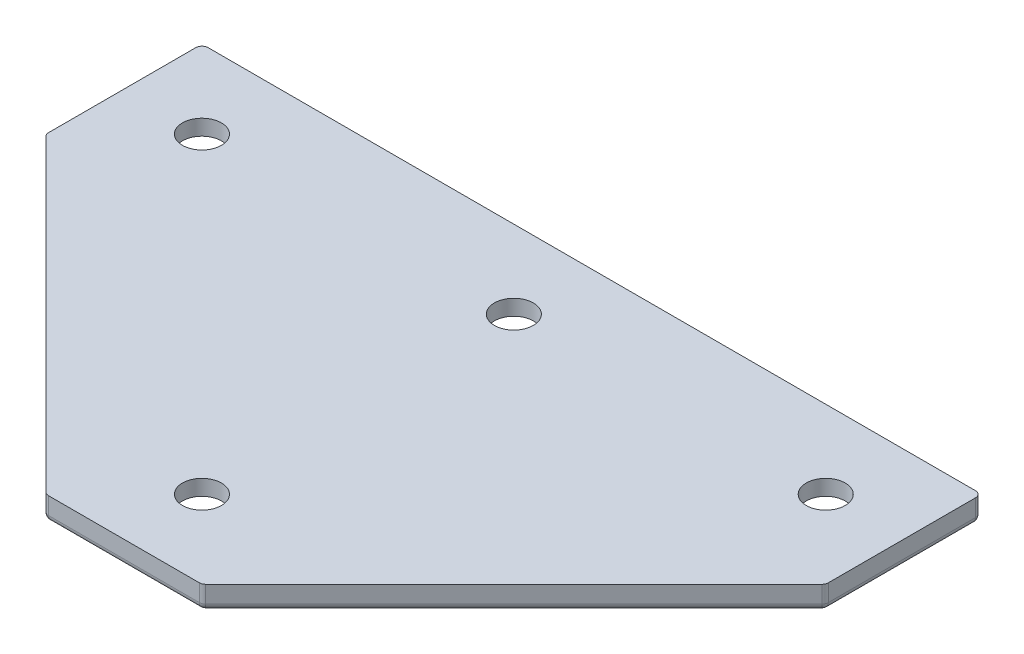
ISO-10303-21;
HEADER;
FILE_DESCRIPTION(('STEP AP214'),'2;1');
FILE_NAME('part.step','',(''),(''),'','','');
FILE_SCHEMA(('AUTOMOTIVE_DESIGN { 1 0 10303 214 1 1 1 1 }'));
ENDSEC;
DATA;
#1=APPLICATION_CONTEXT('core data for automotive mechanical design processes');
#2=APPLICATION_PROTOCOL_DEFINITION('international standard','automotive_design',2000,#1);
#3=PRODUCT_CONTEXT('',#1,'mechanical');
#4=PRODUCT('Part','Part','',(#3));
#5=PRODUCT_RELATED_PRODUCT_CATEGORY('part','',(#4));
#6=PRODUCT_DEFINITION_FORMATION('','',#4);
#7=PRODUCT_DEFINITION_CONTEXT('part definition',#1,'design');
#8=PRODUCT_DEFINITION('design','',#6,#7);
#9=PRODUCT_DEFINITION_SHAPE('','',#8);
#10=(LENGTH_UNIT() NAMED_UNIT(*) SI_UNIT(.MILLI.,.METRE.));
#11=(NAMED_UNIT(*) PLANE_ANGLE_UNIT() SI_UNIT($,.RADIAN.));
#12=(NAMED_UNIT(*) SI_UNIT($,.STERADIAN.) SOLID_ANGLE_UNIT());
#13=UNCERTAINTY_MEASURE_WITH_UNIT(LENGTH_MEASURE(1.E-05),#10,'distance_accuracy_value','');
#14=(GEOMETRIC_REPRESENTATION_CONTEXT(3) GLOBAL_UNCERTAINTY_ASSIGNED_CONTEXT((#13)) GLOBAL_UNIT_ASSIGNED_CONTEXT((#10,
#11,#12)) REPRESENTATION_CONTEXT('',''));
#15=CARTESIAN_POINT('',(0.,0.,0.));
#16=DIRECTION('',(0.,0.,1.));
#17=DIRECTION('',(1.,0.,0.));
#18=AXIS2_PLACEMENT_3D('',#15,#16,#17);
#19=CARTESIAN_POINT('',(-50.,0.,10.));
#20=DIRECTION('',(0.,-1.,0.));
#21=DIRECTION('',(1.,0.,0.));
#22=AXIS2_PLACEMENT_3D('',#19,#20,#21);
#23=CYLINDRICAL_SURFACE('',#22,2.5);
#24=CARTESIAN_POINT('',(-50.,-2.,10.));
#25=DIRECTION('',(0.,-1.,0.));
#26=DIRECTION('',(1.,0.,0.));
#27=AXIS2_PLACEMENT_3D('',#24,#25,#26);
#28=CIRCLE('',#27,2.5);
#29=CARTESIAN_POINT('',(-47.5,-2.,10.));
#30=VERTEX_POINT('',#29);
#31=EDGE_CURVE('E11',#30,#30,#28,.T.);
#32=ORIENTED_EDGE('',*,*,#31,.F.);
#33=EDGE_LOOP('',(#32));
#34=FACE_BOUND('',#33,.T.);
#35=CARTESIAN_POINT('',(-50.,-4.,10.));
#36=DIRECTION('',(0.,-1.,0.));
#37=DIRECTION('',(1.,0.,0.));
#38=AXIS2_PLACEMENT_3D('',#35,#36,#37);
#39=CIRCLE('',#38,2.5);
#40=CARTESIAN_POINT('',(-47.5,-4.,10.));
#41=VERTEX_POINT('',#40);
#42=EDGE_CURVE('E24',#41,#41,#39,.T.);
#43=ORIENTED_EDGE('',*,*,#42,.T.);
#44=EDGE_LOOP('',(#43));
#45=FACE_BOUND('',#44,.T.);
#46=ADVANCED_FACE('F17',(#34,#45),#23,.F.);
#47=CARTESIAN_POINT('',(-90.,0.,10.));
#48=DIRECTION('',(0.,-1.,0.));
#49=DIRECTION('',(1.,0.,0.));
#50=AXIS2_PLACEMENT_3D('',#47,#48,#49);
#51=CYLINDRICAL_SURFACE('',#50,2.5);
#52=CARTESIAN_POINT('',(-90.,-2.,10.));
#53=DIRECTION('',(0.,-1.,0.));
#54=DIRECTION('',(1.,0.,0.));
#55=AXIS2_PLACEMENT_3D('',#52,#53,#54);
#56=CIRCLE('',#55,2.5);
#57=CARTESIAN_POINT('',(-87.5,-2.,10.));
#58=VERTEX_POINT('',#57);
#59=EDGE_CURVE('E316',#58,#58,#56,.T.);
#60=ORIENTED_EDGE('',*,*,#59,.F.);
#61=EDGE_LOOP('',(#60));
#62=FACE_BOUND('',#61,.T.);
#63=CARTESIAN_POINT('',(-90.,-4.,10.));
#64=DIRECTION('',(0.,-1.,0.));
#65=DIRECTION('',(1.,0.,0.));
#66=AXIS2_PLACEMENT_3D('',#63,#64,#65);
#67=CIRCLE('',#66,2.5);
#68=CARTESIAN_POINT('',(-87.5,-4.,10.));
#69=VERTEX_POINT('',#68);
#70=EDGE_CURVE('E313',#69,#69,#67,.T.);
#71=ORIENTED_EDGE('',*,*,#70,.T.);
#72=EDGE_LOOP('',(#71));
#73=FACE_BOUND('',#72,.T.);
#74=ADVANCED_FACE('F342',(#62,#73),#51,.F.);
#75=CARTESIAN_POINT('',(-10.,0.,10.));
#76=DIRECTION('',(0.,-1.,0.));
#77=DIRECTION('',(1.,0.,0.));
#78=AXIS2_PLACEMENT_3D('',#75,#76,#77);
#79=CYLINDRICAL_SURFACE('',#78,2.5);
#80=CARTESIAN_POINT('',(-10.,-2.,10.));
#81=DIRECTION('',(0.,-1.,0.));
#82=DIRECTION('',(1.,0.,0.));
#83=AXIS2_PLACEMENT_3D('',#80,#81,#82);
#84=CIRCLE('',#83,2.5);
#85=CARTESIAN_POINT('',(-7.5,-2.,10.));
#86=VERTEX_POINT('',#85);
#87=EDGE_CURVE('E310',#86,#86,#84,.T.);
#88=ORIENTED_EDGE('',*,*,#87,.F.);
#89=EDGE_LOOP('',(#88));
#90=FACE_BOUND('',#89,.T.);
#91=CARTESIAN_POINT('',(-10.,-4.,10.));
#92=DIRECTION('',(0.,-1.,0.));
#93=DIRECTION('',(1.,0.,0.));
#94=AXIS2_PLACEMENT_3D('',#91,#92,#93);
#95=CIRCLE('',#94,2.5);
#96=CARTESIAN_POINT('',(-7.5,-4.,10.));
#97=VERTEX_POINT('',#96);
#98=EDGE_CURVE('E307',#97,#97,#95,.T.);
#99=ORIENTED_EDGE('',*,*,#98,.T.);
#100=EDGE_LOOP('',(#99));
#101=FACE_BOUND('',#100,.T.);
#102=ADVANCED_FACE('F348',(#90,#101),#79,.F.);
#103=CARTESIAN_POINT('',(-50.,0.,50.));
#104=DIRECTION('',(0.,-1.,0.));
#105=DIRECTION('',(1.,0.,0.));
#106=AXIS2_PLACEMENT_3D('',#103,#104,#105);
#107=CYLINDRICAL_SURFACE('',#106,2.5);
#108=CARTESIAN_POINT('',(-50.,-2.,50.));
#109=DIRECTION('',(0.,-1.,0.));
#110=DIRECTION('',(1.,0.,0.));
#111=AXIS2_PLACEMENT_3D('',#108,#109,#110);
#112=CIRCLE('',#111,2.5);
#113=CARTESIAN_POINT('',(-47.5,-2.,50.));
#114=VERTEX_POINT('',#113);
#115=EDGE_CURVE('E304',#114,#114,#112,.T.);
#116=ORIENTED_EDGE('',*,*,#115,.F.);
#117=EDGE_LOOP('',(#116));
#118=FACE_BOUND('',#117,.T.);
#119=CARTESIAN_POINT('',(-50.,-4.,50.));
#120=DIRECTION('',(0.,-1.,0.));
#121=DIRECTION('',(1.,0.,0.));
#122=AXIS2_PLACEMENT_3D('',#119,#120,#121);
#123=CIRCLE('',#122,2.5);
#124=CARTESIAN_POINT('',(-47.5,-4.,50.));
#125=VERTEX_POINT('',#124);
#126=EDGE_CURVE('E301',#125,#125,#123,.T.);
#127=ORIENTED_EDGE('',*,*,#126,.T.);
#128=EDGE_LOOP('',(#127));
#129=FACE_BOUND('',#128,.T.);
#130=ADVANCED_FACE('F488',(#118,#129),#107,.F.);
#131=CARTESIAN_POINT('',(-60.,-5.,59.9999999999663));
#132=DIRECTION('',(0.,0.,-1.));
#133=DIRECTION('',(0.,1.,0.));
#134=AXIS2_PLACEMENT_3D('',#131,#132,#133);
#135=PLANE('',#134);
#136=DIRECTION('',(-1.,0.,0.));
#137=VECTOR('',#136,1.);
#138=CARTESIAN_POINT('',(-60.,-2.,59.9999999999663));
#139=LINE('',#138,#137);
#140=CARTESIAN_POINT('',(-40.3313708498983,-2.,59.9999999999663));
#141=VERTEX_POINT('',#140);
#142=CARTESIAN_POINT('',(-59.6686291501018,-2.,59.9999999999663));
#143=VERTEX_POINT('',#142);
#144=EDGE_CURVE('E31',#141,#143,#139,.T.);
#145=ORIENTED_EDGE('',*,*,#144,.T.);
#146=DIRECTION('',(0.,1.,0.));
#147=VECTOR('',#146,1.);
#148=CARTESIAN_POINT('',(-59.6686291501018,-5.,59.9999999999663));
#149=LINE('',#148,#147);
#150=CARTESIAN_POINT('',(-59.6686291501018,-4.2,59.9999999999663));
#151=VERTEX_POINT('',#150);
#152=EDGE_CURVE('E36',#143,#151,#149,.F.);
#153=ORIENTED_EDGE('',*,*,#152,.T.);
#154=DIRECTION('',(-1.,0.,0.));
#155=VECTOR('',#154,1.);
#156=CARTESIAN_POINT('',(-40.,-4.2,59.9999999999663));
#157=LINE('',#156,#155);
#158=CARTESIAN_POINT('',(-40.3313708498983,-4.2,59.9999999999663));
#159=VERTEX_POINT('',#158);
#160=EDGE_CURVE('E297',#151,#159,#157,.F.);
#161=ORIENTED_EDGE('',*,*,#160,.T.);
#162=DIRECTION('',(0.,1.,0.));
#163=VECTOR('',#162,1.);
#164=CARTESIAN_POINT('',(-40.3313708498983,-5.,59.9999999999663));
#165=LINE('',#164,#163);
#166=EDGE_CURVE('E295',#159,#141,#165,.T.);
#167=ORIENTED_EDGE('',*,*,#166,.T.);
#168=EDGE_LOOP('',(#145,#153,#161,#167));
#169=FACE_BOUND('',#168,.T.);
#170=ADVANCED_FACE('F485',(#169),#135,.F.);
#171=CARTESIAN_POINT('',(-100.,-5.,20.));
#172=DIRECTION('',(0.70710678118625,0.,-0.707106781186845));
#173=DIRECTION('',(0.707106781186845,0.,0.70710678118625));
#174=AXIS2_PLACEMENT_3D('',#171,#172,#173);
#175=PLANE('',#174);
#176=DIRECTION('',(-0.707106781186845,0.,-0.70710678118625));
#177=VECTOR('',#176,1.);
#178=CARTESIAN_POINT('',(-60.,-4.2,59.9999999999663));
#179=LINE('',#178,#177);
#180=CARTESIAN_POINT('',(-99.765685424949,-4.2,20.2343145750508));
#181=VERTEX_POINT('',#180);
#182=CARTESIAN_POINT('',(-60.2343145750508,-4.2,59.7656854249158));
#183=VERTEX_POINT('',#182);
#184=EDGE_CURVE('E152',#181,#183,#179,.F.);
#185=ORIENTED_EDGE('',*,*,#184,.T.);
#186=DIRECTION('',(0.,1.,0.));
#187=VECTOR('',#186,1.);
#188=CARTESIAN_POINT('',(-60.2343145750508,-5.,59.7656854249158));
#189=LINE('',#188,#187);
#190=CARTESIAN_POINT('',(-60.2343145750508,-2.,59.7656854249158));
#191=VERTEX_POINT('',#190);
#192=EDGE_CURVE('E292',#183,#191,#189,.T.);
#193=ORIENTED_EDGE('',*,*,#192,.T.);
#194=DIRECTION('',(-0.707106781186845,0.,-0.70710678118625));
#195=VECTOR('',#194,1.);
#196=CARTESIAN_POINT('',(-100.,-2.,20.));
#197=LINE('',#196,#195);
#198=CARTESIAN_POINT('',(-99.765685424949,-2.,20.2343145750508));
#199=VERTEX_POINT('',#198);
#200=EDGE_CURVE('E290',#191,#199,#197,.T.);
#201=ORIENTED_EDGE('',*,*,#200,.T.);
#202=DIRECTION('',(0.,1.,0.));
#203=VECTOR('',#202,1.);
#204=CARTESIAN_POINT('',(-99.765685424949,-5.,20.2343145750508));
#205=LINE('',#204,#203);
#206=EDGE_CURVE('E288',#199,#181,#205,.F.);
#207=ORIENTED_EDGE('',*,*,#206,.T.);
#208=EDGE_LOOP('',(#185,#193,#201,#207));
#209=FACE_BOUND('',#208,.T.);
#210=ADVANCED_FACE('F379',(#209),#175,.F.);
#211=CARTESIAN_POINT('',(-100.,-5.,0.));
#212=DIRECTION('',(1.,0.,0.));
#213=DIRECTION('',(0.,1.,0.));
#214=AXIS2_PLACEMENT_3D('',#211,#212,#213);
#215=PLANE('',#214);
#216=DIRECTION('',(0.,0.,-1.));
#217=VECTOR('',#216,1.);
#218=CARTESIAN_POINT('',(-100.,-2.,0.));
#219=LINE('',#218,#217);
#220=CARTESIAN_POINT('',(-100.,-2.,19.6686291501013));
#221=VERTEX_POINT('',#220);
#222=CARTESIAN_POINT('',(-100.,-2.,0.8));
#223=VERTEX_POINT('',#222);
#224=EDGE_CURVE('E286',#221,#223,#219,.T.);
#225=ORIENTED_EDGE('',*,*,#224,.T.);
#226=DIRECTION('',(0.,1.,0.));
#227=VECTOR('',#226,1.);
#228=CARTESIAN_POINT('',(-100.,-5.,0.8));
#229=LINE('',#228,#227);
#230=CARTESIAN_POINT('',(-100.,-4.2,0.8));
#231=VERTEX_POINT('',#230);
#232=EDGE_CURVE('E284',#223,#231,#229,.F.);
#233=ORIENTED_EDGE('',*,*,#232,.T.);
#234=DIRECTION('',(0.,0.,-1.));
#235=VECTOR('',#234,1.);
#236=CARTESIAN_POINT('',(-100.,-4.2,20.));
#237=LINE('',#236,#235);
#238=CARTESIAN_POINT('',(-100.,-4.2,19.6686291501013));
#239=VERTEX_POINT('',#238);
#240=EDGE_CURVE('E282',#231,#239,#237,.F.);
#241=ORIENTED_EDGE('',*,*,#240,.T.);
#242=DIRECTION('',(0.,1.,0.));
#243=VECTOR('',#242,1.);
#244=CARTESIAN_POINT('',(-100.,-5.,19.6686291501013));
#245=LINE('',#244,#243);
#246=EDGE_CURVE('E280',#239,#221,#245,.T.);
#247=ORIENTED_EDGE('',*,*,#246,.T.);
#248=EDGE_LOOP('',(#225,#233,#241,#247));
#249=FACE_BOUND('',#248,.T.);
#250=ADVANCED_FACE('F372',(#249),#215,.F.);
#251=CARTESIAN_POINT('',(-100.,-5.,0.));
#252=DIRECTION('',(0.,0.,1.));
#253=DIRECTION('',(0.,-1.,0.));
#254=AXIS2_PLACEMENT_3D('',#251,#252,#253);
#255=PLANE('',#254);
#256=DIRECTION('',(1.,0.,0.));
#257=VECTOR('',#256,1.);
#258=CARTESIAN_POINT('',(-100.,-4.2,0.));
#259=LINE('',#258,#257);
#260=CARTESIAN_POINT('',(-0.8,-4.2,0.));
#261=VERTEX_POINT('',#260);
#262=CARTESIAN_POINT('',(-99.2,-4.2,0.));
#263=VERTEX_POINT('',#262);
#264=EDGE_CURVE('E278',#261,#263,#259,.F.);
#265=ORIENTED_EDGE('',*,*,#264,.T.);
#266=DIRECTION('',(0.,1.,0.));
#267=VECTOR('',#266,1.);
#268=CARTESIAN_POINT('',(-99.2,-5.,0.));
#269=LINE('',#268,#267);
#270=CARTESIAN_POINT('',(-99.2,-2.,0.));
#271=VERTEX_POINT('',#270);
#272=EDGE_CURVE('E276',#263,#271,#269,.T.);
#273=ORIENTED_EDGE('',*,*,#272,.T.);
#274=DIRECTION('',(1.,0.,0.));
#275=VECTOR('',#274,1.);
#276=CARTESIAN_POINT('',(-100.,-2.,0.));
#277=LINE('',#276,#275);
#278=CARTESIAN_POINT('',(-0.8,-2.,0.));
#279=VERTEX_POINT('',#278);
#280=EDGE_CURVE('E274',#271,#279,#277,.T.);
#281=ORIENTED_EDGE('',*,*,#280,.T.);
#282=DIRECTION('',(0.,1.,0.));
#283=VECTOR('',#282,1.);
#284=CARTESIAN_POINT('',(-0.8,-5.,0.));
#285=LINE('',#284,#283);
#286=EDGE_CURVE('E272',#279,#261,#285,.F.);
#287=ORIENTED_EDGE('',*,*,#286,.T.);
#288=EDGE_LOOP('',(#265,#273,#281,#287));
#289=FACE_BOUND('',#288,.T.);
#290=ADVANCED_FACE('F469',(#289),#255,.F.);
#291=CARTESIAN_POINT('',(0.,-5.,0.));
#292=DIRECTION('',(-1.,0.,0.));
#293=DIRECTION('',(0.,-1.,0.));
#294=AXIS2_PLACEMENT_3D('',#291,#292,#293);
#295=PLANE('',#294);
#296=DIRECTION('',(0.,0.,1.));
#297=VECTOR('',#296,1.);
#298=CARTESIAN_POINT('',(0.,-4.2,0.));
#299=LINE('',#298,#297);
#300=CARTESIAN_POINT('',(0.,-4.2,19.6686291501013));
#301=VERTEX_POINT('',#300);
#302=CARTESIAN_POINT('',(0.,-4.2,0.8));
#303=VERTEX_POINT('',#302);
#304=EDGE_CURVE('E270',#301,#303,#299,.F.);
#305=ORIENTED_EDGE('',*,*,#304,.T.);
#306=DIRECTION('',(0.,1.,0.));
#307=VECTOR('',#306,1.);
#308=CARTESIAN_POINT('',(0.,-5.,0.8));
#309=LINE('',#308,#307);
#310=CARTESIAN_POINT('',(0.,-2.,0.8));
#311=VERTEX_POINT('',#310);
#312=EDGE_CURVE('E268',#303,#311,#309,.T.);
#313=ORIENTED_EDGE('',*,*,#312,.T.);
#314=DIRECTION('',(0.,0.,1.));
#315=VECTOR('',#314,1.);
#316=CARTESIAN_POINT('',(0.,-2.,0.));
#317=LINE('',#316,#315);
#318=CARTESIAN_POINT('',(0.,-2.,19.6686291501013));
#319=VERTEX_POINT('',#318);
#320=EDGE_CURVE('E266',#311,#319,#317,.T.);
#321=ORIENTED_EDGE('',*,*,#320,.T.);
#322=DIRECTION('',(0.,1.,0.));
#323=VECTOR('',#322,1.);
#324=CARTESIAN_POINT('',(0.,-5.,19.6686291501013));
#325=LINE('',#324,#323);
#326=EDGE_CURVE('E264',#319,#301,#325,.F.);
#327=ORIENTED_EDGE('',*,*,#326,.T.);
#328=EDGE_LOOP('',(#305,#313,#321,#327));
#329=FACE_BOUND('',#328,.T.);
#330=ADVANCED_FACE('F471',(#329),#295,.F.);
#331=CARTESIAN_POINT('',(-40.,-5.,59.9999999999663));
#332=DIRECTION('',(-0.70710678118625,0.,-0.707106781186845));
#333=DIRECTION('',(0.707106781186845,0.,-0.70710678118625));
#334=AXIS2_PLACEMENT_3D('',#331,#332,#333);
#335=PLANE('',#334);
#336=DIRECTION('',(-0.707106781186845,0.,0.70710678118625));
#337=VECTOR('',#336,1.);
#338=CARTESIAN_POINT('',(-40.,-2.,59.9999999999663));
#339=LINE('',#338,#337);
#340=CARTESIAN_POINT('',(-0.234314575051,-2.,20.2343145750507));
#341=VERTEX_POINT('',#340);
#342=CARTESIAN_POINT('',(-39.7656854249493,-2.,59.7656854249158));
#343=VERTEX_POINT('',#342);
#344=EDGE_CURVE('E262',#341,#343,#339,.T.);
#345=ORIENTED_EDGE('',*,*,#344,.T.);
#346=DIRECTION('',(0.,1.,0.));
#347=VECTOR('',#346,1.);
#348=CARTESIAN_POINT('',(-39.7656854249493,-5.,59.7656854249158));
#349=LINE('',#348,#347);
#350=CARTESIAN_POINT('',(-39.7656854249493,-4.2,59.7656854249158));
#351=VERTEX_POINT('',#350);
#352=EDGE_CURVE('E260',#343,#351,#349,.F.);
#353=ORIENTED_EDGE('',*,*,#352,.T.);
#354=DIRECTION('',(-0.707106781186845,0.,0.70710678118625));
#355=VECTOR('',#354,1.);
#356=CARTESIAN_POINT('',(0.,-4.2,20.));
#357=LINE('',#356,#355);
#358=CARTESIAN_POINT('',(-0.234314575051,-4.2,20.2343145750507));
#359=VERTEX_POINT('',#358);
#360=EDGE_CURVE('E258',#351,#359,#357,.F.);
#361=ORIENTED_EDGE('',*,*,#360,.T.);
#362=DIRECTION('',(0.,1.,0.));
#363=VECTOR('',#362,1.);
#364=CARTESIAN_POINT('',(-0.234314575051,-5.,20.2343145750507));
#365=LINE('',#364,#363);
#366=EDGE_CURVE('E256',#359,#341,#365,.T.);
#367=ORIENTED_EDGE('',*,*,#366,.T.);
#368=EDGE_LOOP('',(#345,#353,#361,#367));
#369=FACE_BOUND('',#368,.T.);
#370=ADVANCED_FACE('F356',(#369),#335,.F.);
#371=CARTESIAN_POINT('',(0.,-2.,0.));
#372=DIRECTION('',(0.,-1.,0.));
#373=DIRECTION('',(1.,0.,0.));
#374=AXIS2_PLACEMENT_3D('',#371,#372,#373);
#375=PLANE('',#374);
#376=ORIENTED_EDGE('',*,*,#115,.T.);
#377=EDGE_LOOP('',(#376));
#378=FACE_BOUND('',#377,.T.);
#379=ORIENTED_EDGE('',*,*,#87,.T.);
#380=EDGE_LOOP('',(#379));
#381=FACE_BOUND('',#380,.T.);
#382=ORIENTED_EDGE('',*,*,#59,.T.);
#383=EDGE_LOOP('',(#382));
#384=FACE_BOUND('',#383,.T.);
#385=ORIENTED_EDGE('',*,*,#31,.T.);
#386=EDGE_LOOP('',(#385));
#387=FACE_BOUND('',#386,.T.);
#388=ORIENTED_EDGE('',*,*,#280,.F.);
#389=CARTESIAN_POINT('',(-99.2,-2.,0.8));
#390=DIRECTION('',(0.,-1.,0.));
#391=DIRECTION('',(0.,0.,-1.));
#392=AXIS2_PLACEMENT_3D('',#389,#390,#391);
#393=CIRCLE('',#392,0.8);
#394=EDGE_CURVE('E253',#271,#223,#393,.F.);
#395=ORIENTED_EDGE('',*,*,#394,.T.);
#396=ORIENTED_EDGE('',*,*,#224,.F.);
#397=CARTESIAN_POINT('',(-99.2,-2.,19.6686291501013));
#398=DIRECTION('',(0.,-1.,0.));
#399=DIRECTION('',(0.,0.,-1.));
#400=AXIS2_PLACEMENT_3D('',#397,#398,#399);
#401=CIRCLE('',#400,0.8);
#402=EDGE_CURVE('E250',#221,#199,#401,.F.);
#403=ORIENTED_EDGE('',*,*,#402,.T.);
#404=ORIENTED_EDGE('',*,*,#200,.F.);
#405=CARTESIAN_POINT('',(-59.6686291501018,-2.,59.1999999999663));
#406=DIRECTION('',(0.,-1.,0.));
#407=DIRECTION('',(0.,0.,-1.));
#408=AXIS2_PLACEMENT_3D('',#405,#406,#407);
#409=CIRCLE('',#408,0.8);
#410=EDGE_CURVE('E248',#191,#143,#409,.F.);
#411=ORIENTED_EDGE('',*,*,#410,.T.);
#412=ORIENTED_EDGE('',*,*,#144,.F.);
#413=CARTESIAN_POINT('',(-40.3313708498983,-2.,59.1999999999663));
#414=DIRECTION('',(0.,-1.,0.));
#415=DIRECTION('',(0.,0.,-1.));
#416=AXIS2_PLACEMENT_3D('',#413,#414,#415);
#417=CIRCLE('',#416,0.8);
#418=EDGE_CURVE('E245',#141,#343,#417,.F.);
#419=ORIENTED_EDGE('',*,*,#418,.T.);
#420=ORIENTED_EDGE('',*,*,#344,.F.);
#421=CARTESIAN_POINT('',(-0.8,-2.,19.6686291501013));
#422=DIRECTION('',(0.,-1.,0.));
#423=DIRECTION('',(0.,0.,-1.));
#424=AXIS2_PLACEMENT_3D('',#421,#422,#423);
#425=CIRCLE('',#424,0.8);
#426=EDGE_CURVE('E242',#341,#319,#425,.F.);
#427=ORIENTED_EDGE('',*,*,#426,.T.);
#428=ORIENTED_EDGE('',*,*,#320,.F.);
#429=CARTESIAN_POINT('',(-0.8,-2.,0.8));
#430=DIRECTION('',(0.,-1.,0.));
#431=DIRECTION('',(0.,0.,-1.));
#432=AXIS2_PLACEMENT_3D('',#429,#430,#431);
#433=CIRCLE('',#432,0.8);
#434=EDGE_CURVE('E239',#311,#279,#433,.F.);
#435=ORIENTED_EDGE('',*,*,#434,.T.);
#436=EDGE_LOOP('',(#388,#395,#396,#403,#404,#411,#412,#419,#420,#427,#428,#435));
#437=FACE_BOUND('',#436,.T.);
#438=ADVANCED_FACE('F352',(#378,#381,#384,#387,#437),#375,.F.);
#439=CARTESIAN_POINT('',(-50.,-4.,50.));
#440=DIRECTION('',(0.,-1.,0.));
#441=DIRECTION('',(0.,0.,-1.));
#442=AXIS2_PLACEMENT_3D('',#439,#440,#441);
#443=CYLINDRICAL_SURFACE('',#442,4.25);
#444=CARTESIAN_POINT('',(-50.,-4.2,50.));
#445=DIRECTION('',(0.,-1.,0.));
#446=DIRECTION('',(0.,0.,-1.));
#447=AXIS2_PLACEMENT_3D('',#444,#445,#446);
#448=CIRCLE('',#447,4.25);
#449=CARTESIAN_POINT('',(-50.,-4.2,45.75));
#450=VERTEX_POINT('',#449);
#451=EDGE_CURVE('E236',#450,#450,#448,.T.);
#452=ORIENTED_EDGE('',*,*,#451,.T.);
#453=EDGE_LOOP('',(#452));
#454=FACE_BOUND('',#453,.T.);
#455=CARTESIAN_POINT('',(-50.,-4.,50.));
#456=DIRECTION('',(0.,-1.,0.));
#457=DIRECTION('',(0.,0.,-1.));
#458=AXIS2_PLACEMENT_3D('',#455,#456,#457);
#459=CIRCLE('',#458,4.25);
#460=CARTESIAN_POINT('',(-50.,-4.,45.75));
#461=VERTEX_POINT('',#460);
#462=EDGE_CURVE('E233',#461,#461,#459,.T.);
#463=ORIENTED_EDGE('',*,*,#462,.F.);
#464=EDGE_LOOP('',(#463));
#465=FACE_BOUND('',#464,.T.);
#466=ADVANCED_FACE('F355',(#454,#465),#443,.F.);
#467=CARTESIAN_POINT('',(-50.,-4.,29.9999999999832));
#468=DIRECTION('',(0.,-1.,0.));
#469=DIRECTION('',(1.,0.,0.));
#470=AXIS2_PLACEMENT_3D('',#467,#468,#469);
#471=PLANE('',#470);
#472=ORIENTED_EDGE('',*,*,#126,.F.);
#473=EDGE_LOOP('',(#472));
#474=FACE_BOUND('',#473,.T.);
#475=ORIENTED_EDGE('',*,*,#462,.T.);
#476=EDGE_LOOP('',(#475));
#477=FACE_BOUND('',#476,.T.);
#478=ADVANCED_FACE('F508',(#474,#477),#471,.T.);
#479=CARTESIAN_POINT('',(-10.,-4.,10.));
#480=DIRECTION('',(0.,-1.,0.));
#481=DIRECTION('',(0.,0.,-1.));
#482=AXIS2_PLACEMENT_3D('',#479,#480,#481);
#483=CYLINDRICAL_SURFACE('',#482,4.25);
#484=CARTESIAN_POINT('',(-10.,-4.2,10.));
#485=DIRECTION('',(0.,-1.,0.));
#486=DIRECTION('',(0.,0.,-1.));
#487=AXIS2_PLACEMENT_3D('',#484,#485,#486);
#488=CIRCLE('',#487,4.25);
#489=CARTESIAN_POINT('',(-10.,-4.2,5.75));
#490=VERTEX_POINT('',#489);
#491=EDGE_CURVE('E230',#490,#490,#488,.T.);
#492=ORIENTED_EDGE('',*,*,#491,.T.);
#493=EDGE_LOOP('',(#492));
#494=FACE_BOUND('',#493,.T.);
#495=CARTESIAN_POINT('',(-10.,-4.,10.));
#496=DIRECTION('',(0.,-1.,0.));
#497=DIRECTION('',(0.,0.,-1.));
#498=AXIS2_PLACEMENT_3D('',#495,#496,#497);
#499=CIRCLE('',#498,4.25);
#500=CARTESIAN_POINT('',(-10.,-4.,5.75));
#501=VERTEX_POINT('',#500);
#502=EDGE_CURVE('E227',#501,#501,#499,.T.);
#503=ORIENTED_EDGE('',*,*,#502,.F.);
#504=EDGE_LOOP('',(#503));
#505=FACE_BOUND('',#504,.T.);
#506=ADVANCED_FACE('F503',(#494,#505),#483,.F.);
#507=CARTESIAN_POINT('',(-50.,-4.,29.9999999999832));
#508=DIRECTION('',(0.,-1.,0.));
#509=DIRECTION('',(1.,0.,0.));
#510=AXIS2_PLACEMENT_3D('',#507,#508,#509);
#511=PLANE('',#510);
#512=ORIENTED_EDGE('',*,*,#98,.F.);
#513=EDGE_LOOP('',(#512));
#514=FACE_BOUND('',#513,.T.);
#515=ORIENTED_EDGE('',*,*,#502,.T.);
#516=EDGE_LOOP('',(#515));
#517=FACE_BOUND('',#516,.T.);
#518=ADVANCED_FACE('F500',(#514,#517),#511,.T.);
#519=CARTESIAN_POINT('',(-90.,-4.,10.));
#520=DIRECTION('',(0.,-1.,0.));
#521=DIRECTION('',(0.,0.,-1.));
#522=AXIS2_PLACEMENT_3D('',#519,#520,#521);
#523=CYLINDRICAL_SURFACE('',#522,4.25);
#524=CARTESIAN_POINT('',(-90.,-4.2,10.));
#525=DIRECTION('',(0.,-1.,0.));
#526=DIRECTION('',(0.,0.,-1.));
#527=AXIS2_PLACEMENT_3D('',#524,#525,#526);
#528=CIRCLE('',#527,4.25);
#529=CARTESIAN_POINT('',(-90.,-4.2,5.75));
#530=VERTEX_POINT('',#529);
#531=EDGE_CURVE('E224',#530,#530,#528,.T.);
#532=ORIENTED_EDGE('',*,*,#531,.T.);
#533=EDGE_LOOP('',(#532));
#534=FACE_BOUND('',#533,.T.);
#535=CARTESIAN_POINT('',(-90.,-4.,10.));
#536=DIRECTION('',(0.,-1.,0.));
#537=DIRECTION('',(0.,0.,-1.));
#538=AXIS2_PLACEMENT_3D('',#535,#536,#537);
#539=CIRCLE('',#538,4.25);
#540=CARTESIAN_POINT('',(-90.,-4.,5.75));
#541=VERTEX_POINT('',#540);
#542=EDGE_CURVE('E221',#541,#541,#539,.T.);
#543=ORIENTED_EDGE('',*,*,#542,.F.);
#544=EDGE_LOOP('',(#543));
#545=FACE_BOUND('',#544,.T.);
#546=ADVANCED_FACE('F338',(#534,#545),#523,.F.);
#547=CARTESIAN_POINT('',(-50.,-4.,29.9999999999832));
#548=DIRECTION('',(0.,-1.,0.));
#549=DIRECTION('',(1.,0.,0.));
#550=AXIS2_PLACEMENT_3D('',#547,#548,#549);
#551=PLANE('',#550);
#552=ORIENTED_EDGE('',*,*,#70,.F.);
#553=EDGE_LOOP('',(#552));
#554=FACE_BOUND('',#553,.T.);
#555=ORIENTED_EDGE('',*,*,#542,.T.);
#556=EDGE_LOOP('',(#555));
#557=FACE_BOUND('',#556,.T.);
#558=ADVANCED_FACE('F331',(#554,#557),#551,.T.);
#559=CARTESIAN_POINT('',(-50.,-4.,10.));
#560=DIRECTION('',(0.,-1.,0.));
#561=DIRECTION('',(0.,0.,-1.));
#562=AXIS2_PLACEMENT_3D('',#559,#560,#561);
#563=CYLINDRICAL_SURFACE('',#562,4.25);
#564=CARTESIAN_POINT('',(-50.,-4.2,10.));
#565=DIRECTION('',(0.,-1.,0.));
#566=DIRECTION('',(0.,0.,-1.));
#567=AXIS2_PLACEMENT_3D('',#564,#565,#566);
#568=CIRCLE('',#567,4.25);
#569=CARTESIAN_POINT('',(-50.,-4.2,5.75));
#570=VERTEX_POINT('',#569);
#571=EDGE_CURVE('E218',#570,#570,#568,.T.);
#572=ORIENTED_EDGE('',*,*,#571,.T.);
#573=EDGE_LOOP('',(#572));
#574=FACE_BOUND('',#573,.T.);
#575=CARTESIAN_POINT('',(-50.,-4.,10.));
#576=DIRECTION('',(0.,-1.,0.));
#577=DIRECTION('',(0.,0.,-1.));
#578=AXIS2_PLACEMENT_3D('',#575,#576,#577);
#579=CIRCLE('',#578,4.25);
#580=CARTESIAN_POINT('',(-50.,-4.,5.75));
#581=VERTEX_POINT('',#580);
#582=EDGE_CURVE('E215',#581,#581,#579,.T.);
#583=ORIENTED_EDGE('',*,*,#582,.F.);
#584=EDGE_LOOP('',(#583));
#585=FACE_BOUND('',#584,.T.);
#586=ADVANCED_FACE('F326',(#574,#585),#563,.F.);
#587=CARTESIAN_POINT('',(-50.,-4.,29.9999999999832));
#588=DIRECTION('',(0.,-1.,0.));
#589=DIRECTION('',(1.,0.,0.));
#590=AXIS2_PLACEMENT_3D('',#587,#588,#589);
#591=PLANE('',#590);
#592=ORIENTED_EDGE('',*,*,#42,.F.);
#593=EDGE_LOOP('',(#592));
#594=FACE_BOUND('',#593,.T.);
#595=ORIENTED_EDGE('',*,*,#582,.T.);
#596=EDGE_LOOP('',(#595));
#597=FACE_BOUND('',#596,.T.);
#598=ADVANCED_FACE('F322',(#594,#597),#591,.T.);
#599=CARTESIAN_POINT('',(-0.8,-5.,19.6686291501013));
#600=DIRECTION('',(0.,1.,0.));
#601=DIRECTION('',(0.,0.,1.));
#602=AXIS2_PLACEMENT_3D('',#599,#600,#601);
#603=CYLINDRICAL_SURFACE('',#602,0.8);
#604=ORIENTED_EDGE('',*,*,#426,.F.);
#605=ORIENTED_EDGE('',*,*,#366,.F.);
#606=CARTESIAN_POINT('',(-0.8,-4.2,19.6686291501013));
#607=DIRECTION('',(0.,-1.,0.));
#608=DIRECTION('',(0.,0.,-1.));
#609=AXIS2_PLACEMENT_3D('',#606,#607,#608);
#610=CIRCLE('',#609,0.8);
#611=EDGE_CURVE('E212',#301,#359,#610,.T.);
#612=ORIENTED_EDGE('',*,*,#611,.F.);
#613=ORIENTED_EDGE('',*,*,#326,.F.);
#614=EDGE_LOOP('',(#604,#605,#612,#613));
#615=FACE_BOUND('',#614,.T.);
#616=ADVANCED_FACE('F325',(#615),#603,.T.);
#617=CARTESIAN_POINT('',(-0.8,-4.2,0.));
#618=DIRECTION('',(0.,0.,-1.));
#619=DIRECTION('',(-1.,0.,0.));
#620=AXIS2_PLACEMENT_3D('',#617,#618,#619);
#621=CYLINDRICAL_SURFACE('',#620,0.8);
#622=CARTESIAN_POINT('',(-0.8,-4.2,0.8));
#623=DIRECTION('',(0.,0.,-1.));
#624=DIRECTION('',(-1.,0.,0.));
#625=AXIS2_PLACEMENT_3D('',#622,#623,#624);
#626=CIRCLE('',#625,0.8);
#627=CARTESIAN_POINT('',(-0.8,-5.,0.8));
#628=VERTEX_POINT('',#627);
#629=EDGE_CURVE('E209',#303,#628,#626,.T.);
#630=ORIENTED_EDGE('',*,*,#629,.F.);
#631=ORIENTED_EDGE('',*,*,#304,.F.);
#632=CARTESIAN_POINT('',(-0.8,-4.2,19.6686291501013));
#633=DIRECTION('',(0.,0.,1.));
#634=DIRECTION('',(1.,0.,0.));
#635=AXIS2_PLACEMENT_3D('',#632,#633,#634);
#636=CIRCLE('',#635,0.8);
#637=CARTESIAN_POINT('',(-0.8,-5.,19.6686291501013));
#638=VERTEX_POINT('',#637);
#639=EDGE_CURVE('E206',#638,#301,#636,.T.);
#640=ORIENTED_EDGE('',*,*,#639,.F.);
#641=DIRECTION('',(0.,0.,1.));
#642=VECTOR('',#641,1.);
#643=CARTESIAN_POINT('',(-0.8,-5.,20.));
#644=LINE('',#643,#642);
#645=EDGE_CURVE('E203',#628,#638,#644,.T.);
#646=ORIENTED_EDGE('',*,*,#645,.F.);
#647=EDGE_LOOP('',(#630,#631,#640,#646));
#648=FACE_BOUND('',#647,.T.);
#649=ADVANCED_FACE('F441',(#648),#621,.T.);
#650=CARTESIAN_POINT('',(-0.8,-5.,0.8));
#651=DIRECTION('',(0.,1.,0.));
#652=DIRECTION('',(0.,0.,1.));
#653=AXIS2_PLACEMENT_3D('',#650,#651,#652);
#654=CYLINDRICAL_SURFACE('',#653,0.8);
#655=ORIENTED_EDGE('',*,*,#434,.F.);
#656=ORIENTED_EDGE('',*,*,#312,.F.);
#657=CARTESIAN_POINT('',(-0.8,-4.2,0.8));
#658=DIRECTION('',(0.,-1.,0.));
#659=DIRECTION('',(0.,0.,-1.));
#660=AXIS2_PLACEMENT_3D('',#657,#658,#659);
#661=CIRCLE('',#660,0.8);
#662=EDGE_CURVE('E200',#261,#303,#661,.T.);
#663=ORIENTED_EDGE('',*,*,#662,.F.);
#664=ORIENTED_EDGE('',*,*,#286,.F.);
#665=EDGE_LOOP('',(#655,#656,#663,#664));
#666=FACE_BOUND('',#665,.T.);
#667=ADVANCED_FACE('F437',(#666),#654,.T.);
#668=CARTESIAN_POINT('',(-0.8,-4.2,19.6686291501013));
#669=DIRECTION('',(0.,-1.,0.));
#670=DIRECTION('',(1.,0.,0.));
#671=AXIS2_PLACEMENT_3D('',#668,#669,#670);
#672=SPHERICAL_SURFACE('',#671,0.8);
#673=ORIENTED_EDGE('',*,*,#639,.T.);
#674=ORIENTED_EDGE('',*,*,#611,.T.);
#675=CARTESIAN_POINT('',(-0.8,-4.2,19.6686291501013));
#676=DIRECTION('',(0.707106781186844,0.,-0.707106781186251));
#677=DIRECTION('',(-0.707106781186251,0.,-0.707106781186844));
#678=AXIS2_PLACEMENT_3D('',#675,#676,#677);
#679=CIRCLE('',#678,0.8);
#680=EDGE_CURVE('E197',#638,#359,#679,.F.);
#681=ORIENTED_EDGE('',*,*,#680,.F.);
#682=EDGE_LOOP('',(#673,#674,#681));
#683=FACE_BOUND('',#682,.T.);
#684=ADVANCED_FACE('F433',(#683),#672,.T.);
#685=CARTESIAN_POINT('',(-0.8,-4.2,0.8));
#686=DIRECTION('',(1.,0.,0.));
#687=DIRECTION('',(0.,0.,-1.));
#688=AXIS2_PLACEMENT_3D('',#685,#686,#687);
#689=SPHERICAL_SURFACE('',#688,0.8);
#690=ORIENTED_EDGE('',*,*,#662,.T.);
#691=ORIENTED_EDGE('',*,*,#629,.T.);
#692=CARTESIAN_POINT('',(-0.8,-4.2,0.8));
#693=DIRECTION('',(1.,0.,0.));
#694=DIRECTION('',(0.,0.,-1.));
#695=AXIS2_PLACEMENT_3D('',#692,#693,#694);
#696=CIRCLE('',#695,0.8);
#697=EDGE_CURVE('E194',#261,#628,#696,.F.);
#698=ORIENTED_EDGE('',*,*,#697,.F.);
#699=EDGE_LOOP('',(#690,#691,#698));
#700=FACE_BOUND('',#699,.T.);
#701=ADVANCED_FACE('F429',(#700),#689,.T.);
#702=CARTESIAN_POINT('',(-40.3313708498983,-5.,59.1999999999663));
#703=DIRECTION('',(0.,1.,0.));
#704=DIRECTION('',(0.,0.,1.));
#705=AXIS2_PLACEMENT_3D('',#702,#703,#704);
#706=CYLINDRICAL_SURFACE('',#705,0.8);
#707=ORIENTED_EDGE('',*,*,#418,.F.);
#708=ORIENTED_EDGE('',*,*,#166,.F.);
#709=CARTESIAN_POINT('',(-40.3313708498983,-4.2,59.1999999999663));
#710=DIRECTION('',(0.,-1.,0.));
#711=DIRECTION('',(0.,0.,-1.));
#712=AXIS2_PLACEMENT_3D('',#709,#710,#711);
#713=CIRCLE('',#712,0.8);
#714=EDGE_CURVE('E191',#351,#159,#713,.T.);
#715=ORIENTED_EDGE('',*,*,#714,.F.);
#716=ORIENTED_EDGE('',*,*,#352,.F.);
#717=EDGE_LOOP('',(#707,#708,#715,#716));
#718=FACE_BOUND('',#717,.T.);
#719=ADVANCED_FACE('F425',(#718),#706,.T.);
#720=CARTESIAN_POINT('',(9.43431457505098,-4.2,9.43431457505892));
#721=DIRECTION('',(0.707106781186845,0.,-0.70710678118625));
#722=DIRECTION('',(-0.70710678118625,0.,-0.707106781186845));
#723=AXIS2_PLACEMENT_3D('',#720,#721,#722);
#724=CYLINDRICAL_SURFACE('',#723,0.8);
#725=ORIENTED_EDGE('',*,*,#680,.T.);
#726=ORIENTED_EDGE('',*,*,#360,.F.);
#727=CARTESIAN_POINT('',(-40.3313708498983,-4.2,59.1999999999663));
#728=DIRECTION('',(-0.707106781186847,0.,0.707106781186248));
#729=DIRECTION('',(0.707106781186248,0.,0.707106781186847));
#730=AXIS2_PLACEMENT_3D('',#727,#728,#729);
#731=CIRCLE('',#730,0.8);
#732=CARTESIAN_POINT('',(-40.3313708498983,-5.,59.1999999999663));
#733=VERTEX_POINT('',#732);
#734=EDGE_CURVE('E188',#733,#351,#731,.T.);
#735=ORIENTED_EDGE('',*,*,#734,.F.);
#736=DIRECTION('',(-0.707106781186845,0.,0.70710678118625));
#737=VECTOR('',#736,1.);
#738=CARTESIAN_POINT('',(-40.565685424949,-5.,59.4343145750168));
#739=LINE('',#738,#737);
#740=EDGE_CURVE('E186',#638,#733,#739,.T.);
#741=ORIENTED_EDGE('',*,*,#740,.F.);
#742=EDGE_LOOP('',(#725,#726,#735,#741));
#743=FACE_BOUND('',#742,.T.);
#744=ADVANCED_FACE('F421',(#743),#724,.T.);
#745=CARTESIAN_POINT('',(0.,-4.2,0.8));
#746=DIRECTION('',(-1.,0.,0.));
#747=DIRECTION('',(0.,0.,1.));
#748=AXIS2_PLACEMENT_3D('',#745,#746,#747);
#749=CYLINDRICAL_SURFACE('',#748,0.8);
#750=ORIENTED_EDGE('',*,*,#697,.T.);
#751=DIRECTION('',(1.,0.,0.));
#752=VECTOR('',#751,1.);
#753=CARTESIAN_POINT('',(0.,-5.,0.8));
#754=LINE('',#753,#752);
#755=CARTESIAN_POINT('',(-99.2,-5.,0.8));
#756=VERTEX_POINT('',#755);
#757=EDGE_CURVE('E184',#756,#628,#754,.T.);
#758=ORIENTED_EDGE('',*,*,#757,.F.);
#759=CARTESIAN_POINT('',(-99.2,-4.2,0.8));
#760=DIRECTION('',(-1.,0.,0.));
#761=DIRECTION('',(0.,0.,1.));
#762=AXIS2_PLACEMENT_3D('',#759,#760,#761);
#763=CIRCLE('',#762,0.8);
#764=EDGE_CURVE('E181',#263,#756,#763,.T.);
#765=ORIENTED_EDGE('',*,*,#764,.F.);
#766=ORIENTED_EDGE('',*,*,#264,.F.);
#767=EDGE_LOOP('',(#750,#758,#765,#766));
#768=FACE_BOUND('',#767,.T.);
#769=ADVANCED_FACE('F418',(#768),#749,.T.);
#770=CARTESIAN_POINT('',(-99.2,-5.,0.8));
#771=DIRECTION('',(0.,1.,0.));
#772=DIRECTION('',(0.,0.,1.));
#773=AXIS2_PLACEMENT_3D('',#770,#771,#772);
#774=CYLINDRICAL_SURFACE('',#773,0.8);
#775=ORIENTED_EDGE('',*,*,#394,.F.);
#776=ORIENTED_EDGE('',*,*,#272,.F.);
#777=CARTESIAN_POINT('',(-99.2,-4.2,0.8));
#778=DIRECTION('',(0.,-1.,0.));
#779=DIRECTION('',(0.,0.,-1.));
#780=AXIS2_PLACEMENT_3D('',#777,#778,#779);
#781=CIRCLE('',#780,0.8);
#782=EDGE_CURVE('E178',#231,#263,#781,.T.);
#783=ORIENTED_EDGE('',*,*,#782,.F.);
#784=ORIENTED_EDGE('',*,*,#232,.F.);
#785=EDGE_LOOP('',(#775,#776,#783,#784));
#786=FACE_BOUND('',#785,.T.);
#787=ADVANCED_FACE('F369',(#786),#774,.T.);
#788=CARTESIAN_POINT('',(-40.3313708498983,-4.2,59.1999999999663));
#789=DIRECTION('',(0.,-1.,0.));
#790=DIRECTION('',(0.,0.,-1.));
#791=AXIS2_PLACEMENT_3D('',#788,#789,#790);
#792=SPHERICAL_SURFACE('',#791,0.8);
#793=ORIENTED_EDGE('',*,*,#734,.T.);
#794=ORIENTED_EDGE('',*,*,#714,.T.);
#795=CARTESIAN_POINT('',(-40.3313708498983,-4.2,59.1999999999663));
#796=DIRECTION('',(1.,0.,0.));
#797=DIRECTION('',(0.,0.,-1.));
#798=AXIS2_PLACEMENT_3D('',#795,#796,#797);
#799=CIRCLE('',#798,0.8);
#800=EDGE_CURVE('E175',#733,#159,#799,.F.);
#801=ORIENTED_EDGE('',*,*,#800,.F.);
#802=EDGE_LOOP('',(#793,#794,#801));
#803=FACE_BOUND('',#802,.T.);
#804=ADVANCED_FACE('F411',(#803),#792,.T.);
#805=CARTESIAN_POINT('',(-99.2,-4.2,0.8));
#806=DIRECTION('',(0.,0.,-1.));
#807=DIRECTION('',(-1.,0.,0.));
#808=AXIS2_PLACEMENT_3D('',#805,#806,#807);
#809=SPHERICAL_SURFACE('',#808,0.8);
#810=ORIENTED_EDGE('',*,*,#782,.T.);
#811=ORIENTED_EDGE('',*,*,#764,.T.);
#812=CARTESIAN_POINT('',(-99.2,-4.2,0.8));
#813=DIRECTION('',(0.,0.,-1.));
#814=DIRECTION('',(-1.,0.,0.));
#815=AXIS2_PLACEMENT_3D('',#812,#813,#814);
#816=CIRCLE('',#815,0.8);
#817=EDGE_CURVE('E130',#231,#756,#816,.F.);
#818=ORIENTED_EDGE('',*,*,#817,.F.);
#819=EDGE_LOOP('',(#810,#811,#818));
#820=FACE_BOUND('',#819,.T.);
#821=ADVANCED_FACE('F408',(#820),#809,.T.);
#822=CARTESIAN_POINT('',(-59.6686291501018,-5.,59.1999999999663));
#823=DIRECTION('',(0.,1.,0.));
#824=DIRECTION('',(0.,0.,1.));
#825=AXIS2_PLACEMENT_3D('',#822,#823,#824);
#826=CYLINDRICAL_SURFACE('',#825,0.8);
#827=ORIENTED_EDGE('',*,*,#410,.F.);
#828=ORIENTED_EDGE('',*,*,#192,.F.);
#829=CARTESIAN_POINT('',(-59.6686291501018,-4.2,59.1999999999663));
#830=DIRECTION('',(0.,-1.,0.));
#831=DIRECTION('',(0.,0.,-1.));
#832=AXIS2_PLACEMENT_3D('',#829,#830,#831);
#833=CIRCLE('',#832,0.8);
#834=EDGE_CURVE('E171',#151,#183,#833,.T.);
#835=ORIENTED_EDGE('',*,*,#834,.F.);
#836=ORIENTED_EDGE('',*,*,#152,.F.);
#837=EDGE_LOOP('',(#827,#828,#835,#836));
#838=FACE_BOUND('',#837,.T.);
#839=ADVANCED_FACE('F383',(#838),#826,.T.);
#840=CARTESIAN_POINT('',(0.,-4.2,59.1999999999663));
#841=DIRECTION('',(1.,0.,0.));
#842=DIRECTION('',(0.,0.,-1.));
#843=AXIS2_PLACEMENT_3D('',#840,#841,#842);
#844=CYLINDRICAL_SURFACE('',#843,0.8);
#845=ORIENTED_EDGE('',*,*,#800,.T.);
#846=ORIENTED_EDGE('',*,*,#160,.F.);
#847=CARTESIAN_POINT('',(-59.6686291501018,-4.2,59.1999999999663));
#848=DIRECTION('',(-1.,0.,0.));
#849=DIRECTION('',(0.,0.,1.));
#850=AXIS2_PLACEMENT_3D('',#847,#848,#849);
#851=CIRCLE('',#850,0.8);
#852=CARTESIAN_POINT('',(-59.6686291501018,-5.,59.1999999999663));
#853=VERTEX_POINT('',#852);
#854=EDGE_CURVE('E168',#853,#151,#851,.T.);
#855=ORIENTED_EDGE('',*,*,#854,.F.);
#856=DIRECTION('',(-1.,0.,0.));
#857=VECTOR('',#856,1.);
#858=CARTESIAN_POINT('',(-60.,-5.,59.1999999999663));
#859=LINE('',#858,#857);
#860=EDGE_CURVE('E134',#733,#853,#859,.T.);
#861=ORIENTED_EDGE('',*,*,#860,.F.);
#862=EDGE_LOOP('',(#845,#846,#855,#861));
#863=FACE_BOUND('',#862,.T.);
#864=ADVANCED_FACE('F388',(#863),#844,.T.);
#865=CARTESIAN_POINT('',(-99.2,-4.2,0.));
#866=DIRECTION('',(0.,0.,1.));
#867=DIRECTION('',(1.,0.,0.));
#868=AXIS2_PLACEMENT_3D('',#865,#866,#867);
#869=CYLINDRICAL_SURFACE('',#868,0.8);
#870=ORIENTED_EDGE('',*,*,#817,.T.);
#871=DIRECTION('',(0.,0.,-1.));
#872=VECTOR('',#871,1.);
#873=CARTESIAN_POINT('',(-99.2,-5.,0.));
#874=LINE('',#873,#872);
#875=CARTESIAN_POINT('',(-99.2,-5.,19.6686291501013));
#876=VERTEX_POINT('',#875);
#877=EDGE_CURVE('E123',#876,#756,#874,.T.);
#878=ORIENTED_EDGE('',*,*,#877,.F.);
#879=CARTESIAN_POINT('',(-99.2,-4.2,19.6686291501013));
#880=DIRECTION('',(0.,0.,1.));
#881=DIRECTION('',(0.,-1.,0.));
#882=AXIS2_PLACEMENT_3D('',#879,#880,#881);
#883=CIRCLE('',#882,0.8);
#884=EDGE_CURVE('E127',#239,#876,#883,.T.);
#885=ORIENTED_EDGE('',*,*,#884,.F.);
#886=ORIENTED_EDGE('',*,*,#240,.F.);
#887=EDGE_LOOP('',(#870,#878,#885,#886));
#888=FACE_BOUND('',#887,.T.);
#889=ADVANCED_FACE('F125',(#888),#869,.T.);
#890=CARTESIAN_POINT('',(-99.2,-5.,19.6686291501013));
#891=DIRECTION('',(0.,1.,0.));
#892=DIRECTION('',(0.,0.,1.));
#893=AXIS2_PLACEMENT_3D('',#890,#891,#892);
#894=CYLINDRICAL_SURFACE('',#893,0.8);
#895=ORIENTED_EDGE('',*,*,#402,.F.);
#896=ORIENTED_EDGE('',*,*,#246,.F.);
#897=CARTESIAN_POINT('',(-99.2,-4.2,19.6686291501013));
#898=DIRECTION('',(0.,-1.,0.));
#899=DIRECTION('',(0.,0.,-1.));
#900=AXIS2_PLACEMENT_3D('',#897,#898,#899);
#901=CIRCLE('',#900,0.8);
#902=EDGE_CURVE('E144',#181,#239,#901,.T.);
#903=ORIENTED_EDGE('',*,*,#902,.F.);
#904=ORIENTED_EDGE('',*,*,#206,.F.);
#905=EDGE_LOOP('',(#895,#896,#903,#904));
#906=FACE_BOUND('',#905,.T.);
#907=ADVANCED_FACE('F377',(#906),#894,.T.);
#908=CARTESIAN_POINT('',(-59.6686291501018,-4.2,59.1999999999663));
#909=DIRECTION('',(0.,-1.,0.));
#910=DIRECTION('',(1.,0.,0.));
#911=AXIS2_PLACEMENT_3D('',#908,#909,#910);
#912=SPHERICAL_SURFACE('',#911,0.8);
#913=ORIENTED_EDGE('',*,*,#854,.T.);
#914=ORIENTED_EDGE('',*,*,#834,.T.);
#915=CARTESIAN_POINT('',(-59.6686291501018,-4.2,59.1999999999663));
#916=DIRECTION('',(0.707106781186842,0.,0.707106781186253));
#917=DIRECTION('',(0.707106781186253,0.,-0.707106781186842));
#918=AXIS2_PLACEMENT_3D('',#915,#916,#917);
#919=CIRCLE('',#918,0.8);
#920=EDGE_CURVE('E153',#853,#183,#919,.F.);
#921=ORIENTED_EDGE('',*,*,#920,.F.);
#922=EDGE_LOOP('',(#913,#914,#921));
#923=FACE_BOUND('',#922,.T.);
#924=ADVANCED_FACE('F391',(#923),#912,.T.);
#925=CARTESIAN_POINT('',(-99.2,-4.2,19.6686291501013));
#926=DIRECTION('',(0.,-1.,0.));
#927=DIRECTION('',(0.,0.,-1.));
#928=AXIS2_PLACEMENT_3D('',#925,#926,#927);
#929=SPHERICAL_SURFACE('',#928,0.8);
#930=ORIENTED_EDGE('',*,*,#902,.T.);
#931=ORIENTED_EDGE('',*,*,#884,.T.);
#932=CARTESIAN_POINT('',(-99.2,-4.2,19.6686291501013));
#933=DIRECTION('',(-0.707106781186847,0.,-0.707106781186248));
#934=DIRECTION('',(-0.707106781186248,0.,0.707106781186847));
#935=AXIS2_PLACEMENT_3D('',#932,#933,#934);
#936=CIRCLE('',#935,0.8);
#937=EDGE_CURVE('E141',#181,#876,#936,.F.);
#938=ORIENTED_EDGE('',*,*,#937,.F.);
#939=EDGE_LOOP('',(#930,#931,#938));
#940=FACE_BOUND('',#939,.T.);
#941=ADVANCED_FACE('F140',(#940),#929,.T.);
#942=CARTESIAN_POINT('',(-59.4343145750089,-4.2,59.4343145750589));
#943=DIRECTION('',(0.707106781186845,0.,0.70710678118625));
#944=DIRECTION('',(0.70710678118625,0.,-0.707106781186845));
#945=AXIS2_PLACEMENT_3D('',#942,#943,#944);
#946=CYLINDRICAL_SURFACE('',#945,0.8);
#947=ORIENTED_EDGE('',*,*,#920,.T.);
#948=ORIENTED_EDGE('',*,*,#184,.F.);
#949=ORIENTED_EDGE('',*,*,#937,.T.);
#950=DIRECTION('',(-0.707106781186845,0.,-0.70710678118625));
#951=VECTOR('',#950,1.);
#952=CARTESIAN_POINT('',(-99.434314575051,-5.,19.4343145750505));
#953=LINE('',#952,#951);
#954=EDGE_CURVE('E150',#853,#876,#953,.T.);
#955=ORIENTED_EDGE('',*,*,#954,.F.);
#956=EDGE_LOOP('',(#947,#948,#949,#955));
#957=FACE_BOUND('',#956,.T.);
#958=ADVANCED_FACE('F149',(#957),#946,.T.);
#959=CARTESIAN_POINT('',(-10.,-4.2,10.));
#960=DIRECTION('',(0.,-1.,0.));
#961=DIRECTION('',(0.,0.,-1.));
#962=AXIS2_PLACEMENT_3D('',#959,#960,#961);
#963=CONICAL_SURFACE('',#962,4.25,0.785398163397448);
#964=CARTESIAN_POINT('',(-10.,-5.,10.));
#965=DIRECTION('',(0.,-1.,0.));
#966=DIRECTION('',(0.,0.,-1.));
#967=AXIS2_PLACEMENT_3D('',#964,#965,#966);
#968=CIRCLE('',#967,5.05);
#969=CARTESIAN_POINT('',(-10.,-5.,4.95));
#970=VERTEX_POINT('',#969);
#971=EDGE_CURVE('E158',#970,#970,#968,.T.);
#972=ORIENTED_EDGE('',*,*,#971,.T.);
#973=EDGE_LOOP('',(#972));
#974=FACE_BOUND('',#973,.T.);
#975=ORIENTED_EDGE('',*,*,#491,.F.);
#976=EDGE_LOOP('',(#975));
#977=FACE_BOUND('',#976,.T.);
#978=ADVANCED_FACE('F545',(#974,#977),#963,.F.);
#979=CARTESIAN_POINT('',(-90.,-4.2,10.));
#980=DIRECTION('',(0.,-1.,0.));
#981=DIRECTION('',(0.,0.,-1.));
#982=AXIS2_PLACEMENT_3D('',#979,#980,#981);
#983=CONICAL_SURFACE('',#982,4.25,0.785398163397448);
#984=CARTESIAN_POINT('',(-90.,-5.,10.));
#985=DIRECTION('',(0.,-1.,0.));
#986=DIRECTION('',(0.,0.,-1.));
#987=AXIS2_PLACEMENT_3D('',#984,#985,#986);
#988=CIRCLE('',#987,5.05);
#989=CARTESIAN_POINT('',(-90.,-5.,4.95));
#990=VERTEX_POINT('',#989);
#991=EDGE_CURVE('E161',#990,#990,#988,.T.);
#992=ORIENTED_EDGE('',*,*,#991,.T.);
#993=EDGE_LOOP('',(#992));
#994=FACE_BOUND('',#993,.T.);
#995=ORIENTED_EDGE('',*,*,#531,.F.);
#996=EDGE_LOOP('',(#995));
#997=FACE_BOUND('',#996,.T.);
#998=ADVANCED_FACE('F538',(#994,#997),#983,.F.);
#999=CARTESIAN_POINT('',(-50.,-4.2,10.));
#1000=DIRECTION('',(0.,-1.,0.));
#1001=DIRECTION('',(0.,0.,-1.));
#1002=AXIS2_PLACEMENT_3D('',#999,#1000,#1001);
#1003=CONICAL_SURFACE('',#1002,4.25,0.785398163397448);
#1004=CARTESIAN_POINT('',(-50.,-5.,10.));
#1005=DIRECTION('',(0.,-1.,0.));
#1006=DIRECTION('',(0.,0.,-1.));
#1007=AXIS2_PLACEMENT_3D('',#1004,#1005,#1006);
#1008=CIRCLE('',#1007,5.05);
#1009=CARTESIAN_POINT('',(-50.,-5.,4.95));
#1010=VERTEX_POINT('',#1009);
#1011=EDGE_CURVE('E807',#1010,#1010,#1008,.T.);
#1012=ORIENTED_EDGE('',*,*,#1011,.T.);
#1013=EDGE_LOOP('',(#1012));
#1014=FACE_BOUND('',#1013,.T.);
#1015=ORIENTED_EDGE('',*,*,#571,.F.);
#1016=EDGE_LOOP('',(#1015));
#1017=FACE_BOUND('',#1016,.T.);
#1018=ADVANCED_FACE('F529',(#1014,#1017),#1003,.F.);
#1019=CARTESIAN_POINT('',(-50.,-4.2,50.));
#1020=DIRECTION('',(0.,-1.,0.));
#1021=DIRECTION('',(0.,0.,-1.));
#1022=AXIS2_PLACEMENT_3D('',#1019,#1020,#1021);
#1023=CONICAL_SURFACE('',#1022,4.25,0.785398163397449);
#1024=CARTESIAN_POINT('',(-50.,-5.,50.));
#1025=DIRECTION('',(0.,-1.,0.));
#1026=DIRECTION('',(0.,0.,-1.));
#1027=AXIS2_PLACEMENT_3D('',#1024,#1025,#1026);
#1028=CIRCLE('',#1027,5.05);
#1029=CARTESIAN_POINT('',(-50.,-5.,44.95));
#1030=VERTEX_POINT('',#1029);
#1031=EDGE_CURVE('E809',#1030,#1030,#1028,.T.);
#1032=ORIENTED_EDGE('',*,*,#1031,.T.);
#1033=EDGE_LOOP('',(#1032));
#1034=FACE_BOUND('',#1033,.T.);
#1035=ORIENTED_EDGE('',*,*,#451,.F.);
#1036=EDGE_LOOP('',(#1035));
#1037=FACE_BOUND('',#1036,.T.);
#1038=ADVANCED_FACE('F527',(#1034,#1037),#1023,.F.);
#1039=CARTESIAN_POINT('',(-50.,-5.,29.9999999999832));
#1040=DIRECTION('',(0.,-1.,0.));
#1041=DIRECTION('',(1.,0.,0.));
#1042=AXIS2_PLACEMENT_3D('',#1039,#1040,#1041);
#1043=PLANE('',#1042);
#1044=ORIENTED_EDGE('',*,*,#1031,.F.);
#1045=EDGE_LOOP('',(#1044));
#1046=FACE_BOUND('',#1045,.T.);
#1047=ORIENTED_EDGE('',*,*,#1011,.F.);
#1048=EDGE_LOOP('',(#1047));
#1049=FACE_BOUND('',#1048,.T.);
#1050=ORIENTED_EDGE('',*,*,#991,.F.);
#1051=EDGE_LOOP('',(#1050));
#1052=FACE_BOUND('',#1051,.T.);
#1053=ORIENTED_EDGE('',*,*,#971,.F.);
#1054=EDGE_LOOP('',(#1053));
#1055=FACE_BOUND('',#1054,.T.);
#1056=ORIENTED_EDGE('',*,*,#740,.T.);
#1057=ORIENTED_EDGE('',*,*,#860,.T.);
#1058=ORIENTED_EDGE('',*,*,#954,.T.);
#1059=ORIENTED_EDGE('',*,*,#877,.T.);
#1060=ORIENTED_EDGE('',*,*,#757,.T.);
#1061=ORIENTED_EDGE('',*,*,#645,.T.);
#1062=EDGE_LOOP('',(#1056,#1057,#1058,#1059,#1060,#1061));
#1063=FACE_BOUND('',#1062,.T.);
#1064=ADVANCED_FACE('F156',(#1046,#1049,#1052,#1055,#1063),#1043,.T.);
#1065=CLOSED_SHELL('',(#46,#74,#102,#130,#170,#210,#250,#290,#330,#370,#438,#466,#478,#506,#518,
#546,#558,#586,#598,#616,#649,#667,#684,#701,#719,#744,#769,#787,#804,#821,#839,#864,#889,#907,
#924,#941,#958,#978,#998,#1018,#1038,#1064));
#1066=MANIFOLD_SOLID_BREP('B1',#1065);
#1067=ADVANCED_BREP_SHAPE_REPRESENTATION('',(#18,#1066),#14);
#1068=SHAPE_DEFINITION_REPRESENTATION(#9,#1067);
ENDSEC;
END-ISO-10303-21;
